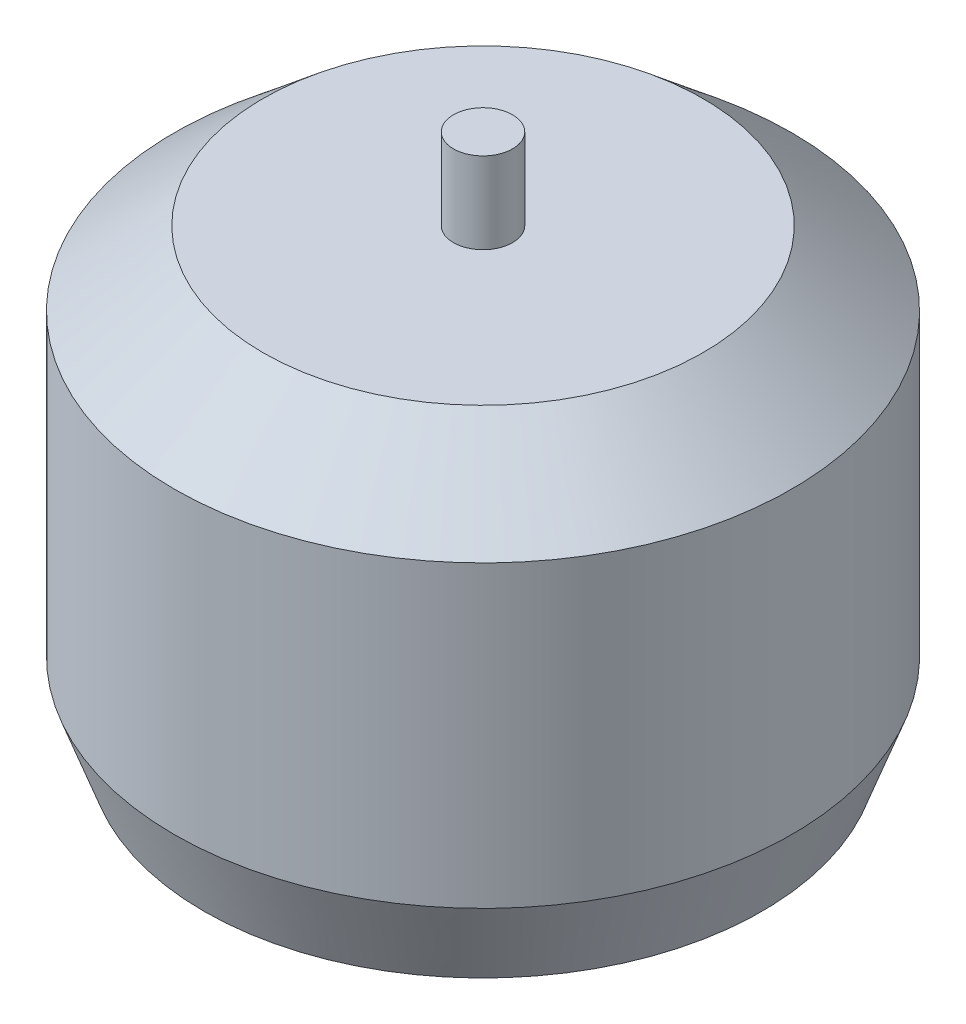
ISO-10303-21;
HEADER;
FILE_DESCRIPTION(('STEP AP214'),'2;1');
FILE_NAME('part.step','',(''),(''),'','','');
FILE_SCHEMA(('AUTOMOTIVE_DESIGN { 1 0 10303 214 1 1 1 1 }'));
ENDSEC;
DATA;
#1=APPLICATION_CONTEXT('core data for automotive mechanical design processes');
#2=APPLICATION_PROTOCOL_DEFINITION('international standard','automotive_design',2000,#1);
#3=PRODUCT_CONTEXT('',#1,'mechanical');
#4=PRODUCT('Part','Part','',(#3));
#5=PRODUCT_RELATED_PRODUCT_CATEGORY('part','',(#4));
#6=PRODUCT_DEFINITION_FORMATION('','',#4);
#7=PRODUCT_DEFINITION_CONTEXT('part definition',#1,'design');
#8=PRODUCT_DEFINITION('design','',#6,#7);
#9=PRODUCT_DEFINITION_SHAPE('','',#8);
#10=(LENGTH_UNIT() NAMED_UNIT(*) SI_UNIT(.MILLI.,.METRE.));
#11=(NAMED_UNIT(*) PLANE_ANGLE_UNIT() SI_UNIT($,.RADIAN.));
#12=(NAMED_UNIT(*) SI_UNIT($,.STERADIAN.) SOLID_ANGLE_UNIT());
#13=UNCERTAINTY_MEASURE_WITH_UNIT(LENGTH_MEASURE(1.E-05),#10,'distance_accuracy_value','');
#14=(GEOMETRIC_REPRESENTATION_CONTEXT(3) GLOBAL_UNCERTAINTY_ASSIGNED_CONTEXT((#13)) GLOBAL_UNIT_ASSIGNED_CONTEXT((#10,
#11,#12)) REPRESENTATION_CONTEXT('',''));
#15=CARTESIAN_POINT('',(0.,0.,0.));
#16=DIRECTION('',(0.,0.,1.));
#17=DIRECTION('',(1.,0.,0.));
#18=AXIS2_PLACEMENT_3D('',#15,#16,#17);
#19=CARTESIAN_POINT('',(-5.64905789440501,30.75,5.32808869585927));
#20=DIRECTION('',(0.,-1.,0.));
#21=DIRECTION('',(0.,0.,-1.));
#22=AXIS2_PLACEMENT_3D('',#19,#20,#21);
#23=CYLINDRICAL_SURFACE('',#22,20.9);
#24=CARTESIAN_POINT('',(-5.64905789440501,5.4949548389092,5.32808869585927));
#25=DIRECTION('',(0.,1.,0.));
#26=DIRECTION('',(0.,0.,1.));
#27=AXIS2_PLACEMENT_3D('',#24,#25,#26);
#28=CIRCLE('',#27,20.9);
#29=CARTESIAN_POINT('',(-5.64905789440501,5.4949548389092,26.2280886958593));
#30=VERTEX_POINT('',#29);
#31=EDGE_CURVE('E42',#30,#30,#28,.T.);
#32=ORIENTED_EDGE('',*,*,#31,.T.);
#33=EDGE_LOOP('',(#32));
#34=FACE_BOUND('',#33,.T.);
#35=CARTESIAN_POINT('',(-5.64905789440501,25.75,5.32808869585927));
#36=DIRECTION('',(0.,1.,0.));
#37=DIRECTION('',(0.,0.,1.));
#38=AXIS2_PLACEMENT_3D('',#35,#36,#37);
#39=CIRCLE('',#38,20.9);
#40=CARTESIAN_POINT('',(-5.64905789440501,25.75,26.2280886958593));
#41=VERTEX_POINT('',#40);
#42=EDGE_CURVE('E46',#41,#41,#39,.F.);
#43=ORIENTED_EDGE('',*,*,#42,.T.);
#44=EDGE_LOOP('',(#43));
#45=FACE_BOUND('',#44,.T.);
#46=ADVANCED_FACE('F31',(#34,#45),#23,.T.);
#47=CARTESIAN_POINT('',(-5.64905789440501,30.75,5.32808869585927));
#48=DIRECTION('',(0.,1.,0.));
#49=DIRECTION('',(0.,0.,1.));
#50=AXIS2_PLACEMENT_3D('',#47,#48,#49);
#51=PLANE('',#50);
#52=CARTESIAN_POINT('',(-5.64905789440501,30.75,5.32808869585927));
#53=DIRECTION('',(0.,1.,0.));
#54=DIRECTION('',(0.,0.,1.));
#55=AXIS2_PLACEMENT_3D('',#52,#53,#54);
#56=CIRCLE('',#55,2.);
#57=CARTESIAN_POINT('',(-5.64905789440501,30.75,7.32808869585927));
#58=VERTEX_POINT('',#57);
#59=EDGE_CURVE('E55',#58,#58,#56,.T.);
#60=ORIENTED_EDGE('',*,*,#59,.F.);
#61=EDGE_LOOP('',(#60));
#62=FACE_BOUND('',#61,.T.);
#63=CARTESIAN_POINT('',(-5.64905789440501,30.75,5.32808869585927));
#64=DIRECTION('',(0.,1.,0.));
#65=DIRECTION('',(0.,0.,1.));
#66=AXIS2_PLACEMENT_3D('',#63,#64,#65);
#67=CIRCLE('',#66,14.8999999999999);
#68=CARTESIAN_POINT('',(-5.64905789440501,30.75,20.2280886958592));
#69=VERTEX_POINT('',#68);
#70=EDGE_CURVE('E51',#69,#69,#67,.T.);
#71=ORIENTED_EDGE('',*,*,#70,.T.);
#72=EDGE_LOOP('',(#71));
#73=FACE_BOUND('',#72,.T.);
#74=ADVANCED_FACE('F79',(#62,#73),#51,.T.);
#75=CARTESIAN_POINT('',(-5.64905789440501,0.,5.32808869585927));
#76=DIRECTION('',(0.,1.,0.));
#77=DIRECTION('',(0.,0.,1.));
#78=AXIS2_PLACEMENT_3D('',#75,#76,#77);
#79=PLANE('',#78);
#80=CARTESIAN_POINT('',(-5.64905789440501,0.,5.32808869585927));
#81=DIRECTION('',(0.,1.,0.));
#82=DIRECTION('',(0.,0.,1.));
#83=AXIS2_PLACEMENT_3D('',#80,#81,#82);
#84=CIRCLE('',#83,4.);
#85=CARTESIAN_POINT('',(-5.64905789440501,0.,9.32808869585928));
#86=VERTEX_POINT('',#85);
#87=EDGE_CURVE('E10',#86,#86,#84,.F.);
#88=ORIENTED_EDGE('',*,*,#87,.F.);
#89=EDGE_LOOP('',(#88));
#90=FACE_BOUND('',#89,.T.);
#91=CARTESIAN_POINT('',(-5.64905789440501,0.,5.32808869585927));
#92=DIRECTION('',(0.,1.,0.));
#93=DIRECTION('',(0.,0.,1.));
#94=AXIS2_PLACEMENT_3D('',#91,#92,#93);
#95=CIRCLE('',#94,18.9);
#96=CARTESIAN_POINT('',(-5.64905789440501,0.,24.2280886958593));
#97=VERTEX_POINT('',#96);
#98=EDGE_CURVE('E38',#97,#97,#95,.F.);
#99=ORIENTED_EDGE('',*,*,#98,.T.);
#100=EDGE_LOOP('',(#99));
#101=FACE_BOUND('',#100,.T.);
#102=ADVANCED_FACE('F85',(#90,#101),#79,.F.);
#103=CARTESIAN_POINT('',(-5.64905789440501,30.75,5.32808869585927));
#104=DIRECTION('',(0.,-1.,0.));
#105=DIRECTION('',(0.,0.,-1.));
#106=AXIS2_PLACEMENT_3D('',#103,#104,#105);
#107=CONICAL_SURFACE('',#106,14.8999999999999,0.876058050598194);
#108=ORIENTED_EDGE('',*,*,#42,.F.);
#109=EDGE_LOOP('',(#108));
#110=FACE_BOUND('',#109,.T.);
#111=ORIENTED_EDGE('',*,*,#70,.F.);
#112=EDGE_LOOP('',(#111));
#113=FACE_BOUND('',#112,.T.);
#114=ADVANCED_FACE('F90',(#110,#113),#107,.T.);
#115=CARTESIAN_POINT('',(-5.64905789440501,5.4949548389092,5.32808869585927));
#116=DIRECTION('',(0.,1.,0.));
#117=DIRECTION('',(0.,0.,1.));
#118=AXIS2_PLACEMENT_3D('',#115,#116,#117);
#119=CONICAL_SURFACE('',#118,20.9,0.349065850398867);
#120=ORIENTED_EDGE('',*,*,#98,.F.);
#121=EDGE_LOOP('',(#120));
#122=FACE_BOUND('',#121,.T.);
#123=ORIENTED_EDGE('',*,*,#31,.F.);
#124=EDGE_LOOP('',(#123));
#125=FACE_BOUND('',#124,.T.);
#126=ADVANCED_FACE('F33',(#122,#125),#119,.T.);
#127=CARTESIAN_POINT('',(-5.64905789440501,36.25,5.32808869585927));
#128=DIRECTION('',(0.,-1.,0.));
#129=DIRECTION('',(0.,0.,-1.));
#130=AXIS2_PLACEMENT_3D('',#127,#128,#129);
#131=CYLINDRICAL_SURFACE('',#130,2.);
#132=CARTESIAN_POINT('',(-5.64905789440501,36.25,5.32808869585927));
#133=DIRECTION('',(0.,1.,0.));
#134=DIRECTION('',(0.,0.,1.));
#135=AXIS2_PLACEMENT_3D('',#132,#133,#134);
#136=CIRCLE('',#135,2.);
#137=CARTESIAN_POINT('',(-5.64905789440501,36.25,7.32808869585927));
#138=VERTEX_POINT('',#137);
#139=EDGE_CURVE('E54',#138,#138,#136,.T.);
#140=ORIENTED_EDGE('',*,*,#139,.F.);
#141=EDGE_LOOP('',(#140));
#142=FACE_BOUND('',#141,.T.);
#143=ORIENTED_EDGE('',*,*,#59,.T.);
#144=EDGE_LOOP('',(#143));
#145=FACE_BOUND('',#144,.T.);
#146=ADVANCED_FACE('F75',(#142,#145),#131,.T.);
#147=CARTESIAN_POINT('',(-5.64905789440501,36.25,5.32808869585927));
#148=DIRECTION('',(0.,1.,0.));
#149=DIRECTION('',(0.,0.,1.));
#150=AXIS2_PLACEMENT_3D('',#147,#148,#149);
#151=PLANE('',#150);
#152=ORIENTED_EDGE('',*,*,#139,.T.);
#153=EDGE_LOOP('',(#152));
#154=FACE_BOUND('',#153,.T.);
#155=ADVANCED_FACE('F68',(#154),#151,.T.);
#156=CARTESIAN_POINT('',(-5.64905789440501,-2.55,5.32808869585927));
#157=DIRECTION('',(0.,1.,0.));
#158=DIRECTION('',(0.,0.,1.));
#159=AXIS2_PLACEMENT_3D('',#156,#157,#158);
#160=CYLINDRICAL_SURFACE('',#159,4.);
#161=CARTESIAN_POINT('',(-5.64905789440501,-2.55,5.32808869585927));
#162=DIRECTION('',(0.,-1.,0.));
#163=DIRECTION('',(0.,0.,-1.));
#164=AXIS2_PLACEMENT_3D('',#161,#162,#163);
#165=CIRCLE('',#164,4.);
#166=CARTESIAN_POINT('',(-5.64905789440501,-2.55,1.32808869585927));
#167=VERTEX_POINT('',#166);
#168=EDGE_CURVE('E58',#167,#167,#165,.T.);
#169=ORIENTED_EDGE('',*,*,#168,.F.);
#170=EDGE_LOOP('',(#169));
#171=FACE_BOUND('',#170,.T.);
#172=ORIENTED_EDGE('',*,*,#87,.T.);
#173=EDGE_LOOP('',(#172));
#174=FACE_BOUND('',#173,.T.);
#175=ADVANCED_FACE('F66',(#171,#174),#160,.T.);
#176=CARTESIAN_POINT('',(-5.64905789440501,-2.55,5.32808869585927));
#177=DIRECTION('',(0.,-1.,0.));
#178=DIRECTION('',(0.,0.,-1.));
#179=AXIS2_PLACEMENT_3D('',#176,#177,#178);
#180=PLANE('',#179);
#181=ORIENTED_EDGE('',*,*,#168,.T.);
#182=EDGE_LOOP('',(#181));
#183=FACE_BOUND('',#182,.T.);
#184=ADVANCED_FACE('F64',(#183),#180,.T.);
#185=CLOSED_SHELL('',(#46,#74,#102,#114,#126,#146,#155,#175,#184));
#186=MANIFOLD_SOLID_BREP('B2',#185);
#187=ADVANCED_BREP_SHAPE_REPRESENTATION('',(#18,#186),#14);
#188=SHAPE_DEFINITION_REPRESENTATION(#9,#187);
ENDSEC;
END-ISO-10303-21;
